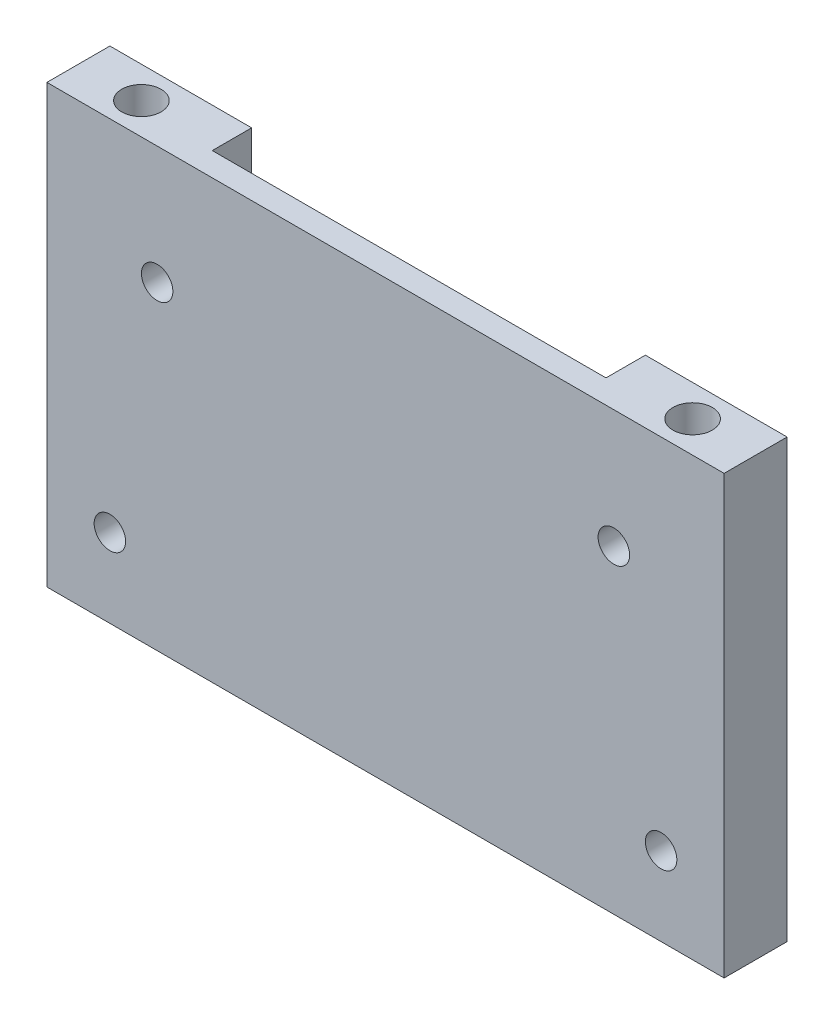
ISO-10303-21;
HEADER;
FILE_DESCRIPTION(('STEP AP214'),'2;1');
FILE_NAME('part.step','',(''),(''),'','','');
FILE_SCHEMA(('AUTOMOTIVE_DESIGN { 1 0 10303 214 1 1 1 1 }'));
ENDSEC;
DATA;
#1=APPLICATION_CONTEXT('core data for automotive mechanical design processes');
#2=APPLICATION_PROTOCOL_DEFINITION('international standard','automotive_design',2000,#1);
#3=PRODUCT_CONTEXT('',#1,'mechanical');
#4=PRODUCT('Part','Part','',(#3));
#5=PRODUCT_RELATED_PRODUCT_CATEGORY('part','',(#4));
#6=PRODUCT_DEFINITION_FORMATION('','',#4);
#7=PRODUCT_DEFINITION_CONTEXT('part definition',#1,'design');
#8=PRODUCT_DEFINITION('design','',#6,#7);
#9=PRODUCT_DEFINITION_SHAPE('','',#8);
#10=(LENGTH_UNIT() NAMED_UNIT(*) SI_UNIT(.MILLI.,.METRE.));
#11=(NAMED_UNIT(*) PLANE_ANGLE_UNIT() SI_UNIT($,.RADIAN.));
#12=(NAMED_UNIT(*) SI_UNIT($,.STERADIAN.) SOLID_ANGLE_UNIT());
#13=UNCERTAINTY_MEASURE_WITH_UNIT(LENGTH_MEASURE(1.E-05),#10,'distance_accuracy_value','');
#14=(GEOMETRIC_REPRESENTATION_CONTEXT(3) GLOBAL_UNCERTAINTY_ASSIGNED_CONTEXT((#13)) GLOBAL_UNIT_ASSIGNED_CONTEXT((#10,
#11,#12)) REPRESENTATION_CONTEXT('',''));
#15=CARTESIAN_POINT('',(0.,0.,0.));
#16=DIRECTION('',(0.,0.,1.));
#17=DIRECTION('',(1.,0.,0.));
#18=AXIS2_PLACEMENT_3D('',#15,#16,#17);
#19=CARTESIAN_POINT('',(0.,55.5,0.));
#20=DIRECTION('',(0.,0.,-1.));
#21=DIRECTION('',(-1.,0.,0.));
#22=AXIS2_PLACEMENT_3D('',#19,#20,#21);
#23=PLANE('',#22);
#24=CARTESIAN_POINT('',(78.,10.,0.));
#25=DIRECTION('',(0.,0.,-1.));
#26=DIRECTION('',(-1.,0.,0.));
#27=AXIS2_PLACEMENT_3D('',#24,#25,#26);
#28=CIRCLE('',#27,2.);
#29=CARTESIAN_POINT('',(76.,10.,0.));
#30=VERTEX_POINT('',#29);
#31=EDGE_CURVE('E221',#30,#30,#28,.T.);
#32=ORIENTED_EDGE('',*,*,#31,.F.);
#33=EDGE_LOOP('',(#32));
#34=FACE_BOUND('',#33,.T.);
#35=CARTESIAN_POINT('',(72.,40.5,0.));
#36=DIRECTION('',(0.,0.,-1.));
#37=DIRECTION('',(-1.,0.,0.));
#38=AXIS2_PLACEMENT_3D('',#35,#36,#37);
#39=CIRCLE('',#38,2.);
#40=CARTESIAN_POINT('',(70.,40.5,0.));
#41=VERTEX_POINT('',#40);
#42=EDGE_CURVE('E232',#41,#41,#39,.T.);
#43=ORIENTED_EDGE('',*,*,#42,.F.);
#44=EDGE_LOOP('',(#43));
#45=FACE_BOUND('',#44,.T.);
#46=DIRECTION('',(0.,-1.,0.));
#47=VECTOR('',#46,1.);
#48=CARTESIAN_POINT('',(68.,55.5,0.));
#49=LINE('',#48,#47);
#50=CARTESIAN_POINT('',(68.,55.5,0.));
#51=VERTEX_POINT('',#50);
#52=CARTESIAN_POINT('',(68.,0.,0.));
#53=VERTEX_POINT('',#52);
#54=EDGE_CURVE('E97',#51,#53,#49,.T.);
#55=ORIENTED_EDGE('',*,*,#54,.F.);
#56=DIRECTION('',(-1.,0.,0.));
#57=VECTOR('',#56,1.);
#58=CARTESIAN_POINT('',(0.,55.5,0.));
#59=LINE('',#58,#57);
#60=CARTESIAN_POINT('',(86.,55.5,0.));
#61=VERTEX_POINT('',#60);
#62=EDGE_CURVE('E134',#61,#51,#59,.T.);
#63=ORIENTED_EDGE('',*,*,#62,.F.);
#64=DIRECTION('',(0.,1.,0.));
#65=VECTOR('',#64,1.);
#66=CARTESIAN_POINT('',(86.,0.,0.));
#67=LINE('',#66,#65);
#68=CARTESIAN_POINT('',(86.,0.,0.));
#69=VERTEX_POINT('',#68);
#70=EDGE_CURVE('E122',#69,#61,#67,.T.);
#71=ORIENTED_EDGE('',*,*,#70,.F.);
#72=DIRECTION('',(1.,0.,0.));
#73=VECTOR('',#72,1.);
#74=CARTESIAN_POINT('',(0.,0.,0.));
#75=LINE('',#74,#73);
#76=EDGE_CURVE('E115',#53,#69,#75,.T.);
#77=ORIENTED_EDGE('',*,*,#76,.F.);
#78=EDGE_LOOP('',(#55,#63,#71,#77));
#79=FACE_BOUND('',#78,.T.);
#80=ADVANCED_FACE('F32',(#34,#45,#79),#23,.T.);
#81=CARTESIAN_POINT('',(0.,0.,8.));
#82=DIRECTION('',(1.,0.,0.));
#83=DIRECTION('',(0.,0.,-1.));
#84=AXIS2_PLACEMENT_3D('',#81,#82,#83);
#85=PLANE('',#84);
#86=DIRECTION('',(0.,-1.,0.));
#87=VECTOR('',#86,1.);
#88=CARTESIAN_POINT('',(0.,0.,0.));
#89=LINE('',#88,#87);
#90=CARTESIAN_POINT('',(0.,55.5,0.));
#91=VERTEX_POINT('',#90);
#92=CARTESIAN_POINT('',(0.,0.,0.));
#93=VERTEX_POINT('',#92);
#94=EDGE_CURVE('E124',#91,#93,#89,.T.);
#95=ORIENTED_EDGE('',*,*,#94,.T.);
#96=DIRECTION('',(0.,0.,-1.));
#97=VECTOR('',#96,1.);
#98=CARTESIAN_POINT('',(0.,0.,8.));
#99=LINE('',#98,#97);
#100=CARTESIAN_POINT('',(0.,0.,8.));
#101=VERTEX_POINT('',#100);
#102=EDGE_CURVE('E11',#101,#93,#99,.T.);
#103=ORIENTED_EDGE('',*,*,#102,.F.);
#104=DIRECTION('',(0.,-1.,0.));
#105=VECTOR('',#104,1.);
#106=CARTESIAN_POINT('',(0.,0.,8.));
#107=LINE('',#106,#105);
#108=CARTESIAN_POINT('',(0.,55.5,8.));
#109=VERTEX_POINT('',#108);
#110=EDGE_CURVE('E136',#109,#101,#107,.T.);
#111=ORIENTED_EDGE('',*,*,#110,.F.);
#112=DIRECTION('',(0.,0.,-1.));
#113=VECTOR('',#112,1.);
#114=CARTESIAN_POINT('',(0.,55.5,8.));
#115=LINE('',#114,#113);
#116=EDGE_CURVE('E143',#109,#91,#115,.T.);
#117=ORIENTED_EDGE('',*,*,#116,.T.);
#118=EDGE_LOOP('',(#95,#103,#111,#117));
#119=FACE_BOUND('',#118,.T.);
#120=ADVANCED_FACE('F34',(#119),#85,.F.);
#121=CARTESIAN_POINT('',(0.,0.,8.));
#122=DIRECTION('',(0.,1.,0.));
#123=DIRECTION('',(0.,0.,1.));
#124=AXIS2_PLACEMENT_3D('',#121,#122,#123);
#125=PLANE('',#124);
#126=DIRECTION('',(-1.,0.,0.));
#127=VECTOR('',#126,1.);
#128=CARTESIAN_POINT('',(68.,0.,5.));
#129=LINE('',#128,#127);
#130=CARTESIAN_POINT('',(68.,0.,5.));
#131=VERTEX_POINT('',#130);
#132=CARTESIAN_POINT('',(18.,0.,5.));
#133=VERTEX_POINT('',#132);
#134=EDGE_CURVE('E118',#131,#133,#129,.T.);
#135=ORIENTED_EDGE('',*,*,#134,.F.);
#136=DIRECTION('',(0.,0.,-1.));
#137=VECTOR('',#136,1.);
#138=CARTESIAN_POINT('',(68.,0.,5.));
#139=LINE('',#138,#137);
#140=EDGE_CURVE('E100',#131,#53,#139,.T.);
#141=ORIENTED_EDGE('',*,*,#140,.T.);
#142=ORIENTED_EDGE('',*,*,#76,.T.);
#143=DIRECTION('',(0.,0.,-1.));
#144=VECTOR('',#143,1.);
#145=CARTESIAN_POINT('',(86.,0.,8.));
#146=LINE('',#145,#144);
#147=CARTESIAN_POINT('',(86.,0.,8.));
#148=VERTEX_POINT('',#147);
#149=EDGE_CURVE('E40',#148,#69,#146,.T.);
#150=ORIENTED_EDGE('',*,*,#149,.F.);
#151=DIRECTION('',(1.,0.,0.));
#152=VECTOR('',#151,1.);
#153=CARTESIAN_POINT('',(0.,0.,8.));
#154=LINE('',#153,#152);
#155=EDGE_CURVE('E138',#101,#148,#154,.T.);
#156=ORIENTED_EDGE('',*,*,#155,.F.);
#157=ORIENTED_EDGE('',*,*,#102,.T.);
#158=CARTESIAN_POINT('',(18.,0.,0.));
#159=VERTEX_POINT('',#158);
#160=EDGE_CURVE('E123',#93,#159,#75,.T.);
#161=ORIENTED_EDGE('',*,*,#160,.T.);
#162=DIRECTION('',(0.,0.,-1.));
#163=VECTOR('',#162,1.);
#164=CARTESIAN_POINT('',(18.,0.,5.));
#165=LINE('',#164,#163);
#166=EDGE_CURVE('E47',#133,#159,#165,.T.);
#167=ORIENTED_EDGE('',*,*,#166,.F.);
#168=EDGE_LOOP('',(#135,#141,#142,#150,#156,#157,#161,#167));
#169=FACE_BOUND('',#168,.T.);
#170=ADVANCED_FACE('F113',(#169),#125,.F.);
#171=CARTESIAN_POINT('',(86.,0.,8.));
#172=DIRECTION('',(-1.,0.,0.));
#173=DIRECTION('',(0.,0.,1.));
#174=AXIS2_PLACEMENT_3D('',#171,#172,#173);
#175=PLANE('',#174);
#176=ORIENTED_EDGE('',*,*,#70,.T.);
#177=DIRECTION('',(0.,0.,-1.));
#178=VECTOR('',#177,1.);
#179=CARTESIAN_POINT('',(86.,55.5,8.));
#180=LINE('',#179,#178);
#181=CARTESIAN_POINT('',(86.,55.5,8.));
#182=VERTEX_POINT('',#181);
#183=EDGE_CURVE('E146',#182,#61,#180,.T.);
#184=ORIENTED_EDGE('',*,*,#183,.F.);
#185=DIRECTION('',(0.,1.,0.));
#186=VECTOR('',#185,1.);
#187=CARTESIAN_POINT('',(86.,0.,8.));
#188=LINE('',#187,#186);
#189=EDGE_CURVE('E140',#148,#182,#188,.T.);
#190=ORIENTED_EDGE('',*,*,#189,.F.);
#191=ORIENTED_EDGE('',*,*,#149,.T.);
#192=EDGE_LOOP('',(#176,#184,#190,#191));
#193=FACE_BOUND('',#192,.T.);
#194=ADVANCED_FACE('F150',(#193),#175,.F.);
#195=CARTESIAN_POINT('',(0.,55.5,8.));
#196=DIRECTION('',(0.,-1.,0.));
#197=DIRECTION('',(0.,0.,-1.));
#198=AXIS2_PLACEMENT_3D('',#195,#196,#197);
#199=PLANE('',#198);
#200=ORIENTED_EDGE('',*,*,#62,.T.);
#201=DIRECTION('',(0.,0.,-1.));
#202=VECTOR('',#201,1.);
#203=CARTESIAN_POINT('',(68.,55.5,5.));
#204=LINE('',#203,#202);
#205=CARTESIAN_POINT('',(68.,55.5,5.));
#206=VERTEX_POINT('',#205);
#207=EDGE_CURVE('E103',#206,#51,#204,.T.);
#208=ORIENTED_EDGE('',*,*,#207,.F.);
#209=DIRECTION('',(1.,0.,0.));
#210=VECTOR('',#209,1.);
#211=CARTESIAN_POINT('',(68.,55.5,5.));
#212=LINE('',#211,#210);
#213=CARTESIAN_POINT('',(18.,55.5,5.));
#214=VERTEX_POINT('',#213);
#215=EDGE_CURVE('E119',#214,#206,#212,.T.);
#216=ORIENTED_EDGE('',*,*,#215,.F.);
#217=DIRECTION('',(0.,0.,-1.));
#218=VECTOR('',#217,1.);
#219=CARTESIAN_POINT('',(18.,55.5,5.));
#220=LINE('',#219,#218);
#221=CARTESIAN_POINT('',(18.,55.5,0.));
#222=VERTEX_POINT('',#221);
#223=EDGE_CURVE('E160',#214,#222,#220,.T.);
#224=ORIENTED_EDGE('',*,*,#223,.T.);
#225=EDGE_CURVE('E133',#222,#91,#59,.T.);
#226=ORIENTED_EDGE('',*,*,#225,.T.);
#227=ORIENTED_EDGE('',*,*,#116,.F.);
#228=DIRECTION('',(-1.,0.,0.));
#229=VECTOR('',#228,1.);
#230=CARTESIAN_POINT('',(0.,55.5,8.));
#231=LINE('',#230,#229);
#232=EDGE_CURVE('E55',#182,#109,#231,.T.);
#233=ORIENTED_EDGE('',*,*,#232,.F.);
#234=ORIENTED_EDGE('',*,*,#183,.T.);
#235=EDGE_LOOP('',(#200,#208,#216,#224,#226,#227,#233,#234));
#236=FACE_BOUND('',#235,.T.);
#237=CARTESIAN_POINT('',(7.99999999999999,55.5,4.00000000000001));
#238=DIRECTION('',(0.,1.,0.));
#239=DIRECTION('',(0.,0.,1.));
#240=AXIS2_PLACEMENT_3D('',#237,#238,#239);
#241=CIRCLE('',#240,2.5);
#242=CARTESIAN_POINT('',(7.99999999999999,55.5,6.50000000000001));
#243=VERTEX_POINT('',#242);
#244=EDGE_CURVE('E166',#243,#243,#241,.T.);
#245=ORIENTED_EDGE('',*,*,#244,.F.);
#246=EDGE_LOOP('',(#245));
#247=FACE_BOUND('',#246,.T.);
#248=CARTESIAN_POINT('',(78.,55.5,4.));
#249=DIRECTION('',(0.,1.,0.));
#250=DIRECTION('',(0.,0.,1.));
#251=AXIS2_PLACEMENT_3D('',#248,#249,#250);
#252=CIRCLE('',#251,2.49999999999999);
#253=CARTESIAN_POINT('',(78.,55.5,6.49999999999999));
#254=VERTEX_POINT('',#253);
#255=EDGE_CURVE('E172',#254,#254,#252,.T.);
#256=ORIENTED_EDGE('',*,*,#255,.F.);
#257=EDGE_LOOP('',(#256));
#258=FACE_BOUND('',#257,.T.);
#259=ADVANCED_FACE('F185',(#236,#247,#258),#199,.F.);
#260=CARTESIAN_POINT('',(0.,55.5,8.));
#261=DIRECTION('',(0.,0.,-1.));
#262=DIRECTION('',(-1.,0.,0.));
#263=AXIS2_PLACEMENT_3D('',#260,#261,#262);
#264=PLANE('',#263);
#265=CARTESIAN_POINT('',(7.99999999999998,10.,8.));
#266=DIRECTION('',(0.,0.,-1.));
#267=DIRECTION('',(-1.,0.,0.));
#268=AXIS2_PLACEMENT_3D('',#265,#266,#267);
#269=CIRCLE('',#268,2.);
#270=CARTESIAN_POINT('',(5.99999999999998,10.,8.));
#271=VERTEX_POINT('',#270);
#272=EDGE_CURVE('E218',#271,#271,#269,.T.);
#273=ORIENTED_EDGE('',*,*,#272,.T.);
#274=EDGE_LOOP('',(#273));
#275=FACE_BOUND('',#274,.T.);
#276=CARTESIAN_POINT('',(14.,40.5,8.));
#277=DIRECTION('',(0.,0.,-1.));
#278=DIRECTION('',(-1.,0.,0.));
#279=AXIS2_PLACEMENT_3D('',#276,#277,#278);
#280=CIRCLE('',#279,2.);
#281=CARTESIAN_POINT('',(12.,40.5,8.));
#282=VERTEX_POINT('',#281);
#283=EDGE_CURVE('E217',#282,#282,#280,.T.);
#284=ORIENTED_EDGE('',*,*,#283,.T.);
#285=EDGE_LOOP('',(#284));
#286=FACE_BOUND('',#285,.T.);
#287=CARTESIAN_POINT('',(78.,10.,8.));
#288=DIRECTION('',(0.,0.,-1.));
#289=DIRECTION('',(-1.,0.,0.));
#290=AXIS2_PLACEMENT_3D('',#287,#288,#289);
#291=CIRCLE('',#290,2.);
#292=CARTESIAN_POINT('',(76.,10.,8.));
#293=VERTEX_POINT('',#292);
#294=EDGE_CURVE('E229',#293,#293,#291,.T.);
#295=ORIENTED_EDGE('',*,*,#294,.T.);
#296=EDGE_LOOP('',(#295));
#297=FACE_BOUND('',#296,.T.);
#298=CARTESIAN_POINT('',(72.,40.5,8.));
#299=DIRECTION('',(0.,0.,-1.));
#300=DIRECTION('',(-1.,0.,0.));
#301=AXIS2_PLACEMENT_3D('',#298,#299,#300);
#302=CIRCLE('',#301,2.);
#303=CARTESIAN_POINT('',(70.,40.5,8.));
#304=VERTEX_POINT('',#303);
#305=EDGE_CURVE('E109',#304,#304,#302,.T.);
#306=ORIENTED_EDGE('',*,*,#305,.T.);
#307=EDGE_LOOP('',(#306));
#308=FACE_BOUND('',#307,.T.);
#309=ORIENTED_EDGE('',*,*,#110,.T.);
#310=ORIENTED_EDGE('',*,*,#155,.T.);
#311=ORIENTED_EDGE('',*,*,#189,.T.);
#312=ORIENTED_EDGE('',*,*,#232,.T.);
#313=EDGE_LOOP('',(#309,#310,#311,#312));
#314=FACE_BOUND('',#313,.T.);
#315=ADVANCED_FACE('F154',(#275,#286,#297,#308,#314),#264,.F.);
#316=CARTESIAN_POINT('',(7.99999999999998,10.,0.));
#317=DIRECTION('',(0.,0.,-1.));
#318=DIRECTION('',(-1.,0.,0.));
#319=AXIS2_PLACEMENT_3D('',#316,#317,#318);
#320=CIRCLE('',#319,2.);
#321=CARTESIAN_POINT('',(5.99999999999998,10.,0.));
#322=VERTEX_POINT('',#321);
#323=EDGE_CURVE('E212',#322,#322,#320,.T.);
#324=ORIENTED_EDGE('',*,*,#323,.F.);
#325=EDGE_LOOP('',(#324));
#326=FACE_BOUND('',#325,.T.);
#327=CARTESIAN_POINT('',(14.,40.5,0.));
#328=DIRECTION('',(0.,0.,-1.));
#329=DIRECTION('',(-1.,0.,0.));
#330=AXIS2_PLACEMENT_3D('',#327,#328,#329);
#331=CIRCLE('',#330,2.);
#332=CARTESIAN_POINT('',(12.,40.5,0.));
#333=VERTEX_POINT('',#332);
#334=EDGE_CURVE('E215',#333,#333,#331,.T.);
#335=ORIENTED_EDGE('',*,*,#334,.F.);
#336=EDGE_LOOP('',(#335));
#337=FACE_BOUND('',#336,.T.);
#338=DIRECTION('',(0.,1.,0.));
#339=VECTOR('',#338,1.);
#340=CARTESIAN_POINT('',(18.,55.5,0.));
#341=LINE('',#340,#339);
#342=EDGE_CURVE('E108',#159,#222,#341,.T.);
#343=ORIENTED_EDGE('',*,*,#342,.F.);
#344=ORIENTED_EDGE('',*,*,#160,.F.);
#345=ORIENTED_EDGE('',*,*,#94,.F.);
#346=ORIENTED_EDGE('',*,*,#225,.F.);
#347=EDGE_LOOP('',(#343,#344,#345,#346));
#348=FACE_BOUND('',#347,.T.);
#349=ADVANCED_FACE('F159',(#326,#337,#348),#23,.T.);
#350=CARTESIAN_POINT('',(78.,30.5,4.));
#351=DIRECTION('',(0.,1.,0.));
#352=DIRECTION('',(0.,0.,1.));
#353=AXIS2_PLACEMENT_3D('',#350,#351,#352);
#354=CYLINDRICAL_SURFACE('',#353,2.49999999999999);
#355=CARTESIAN_POINT('',(78.,30.5,4.));
#356=DIRECTION('',(0.,1.,0.));
#357=DIRECTION('',(0.,0.,1.));
#358=AXIS2_PLACEMENT_3D('',#355,#356,#357);
#359=CIRCLE('',#358,2.49999999999999);
#360=CARTESIAN_POINT('',(78.,30.5,6.49999999999999));
#361=VERTEX_POINT('',#360);
#362=EDGE_CURVE('E128',#361,#361,#359,.T.);
#363=ORIENTED_EDGE('',*,*,#362,.F.);
#364=EDGE_LOOP('',(#363));
#365=FACE_BOUND('',#364,.T.);
#366=ORIENTED_EDGE('',*,*,#255,.T.);
#367=EDGE_LOOP('',(#366));
#368=FACE_BOUND('',#367,.T.);
#369=ADVANCED_FACE('F179',(#365,#368),#354,.F.);
#370=CARTESIAN_POINT('',(78.,30.5,4.));
#371=DIRECTION('',(0.,1.,0.));
#372=DIRECTION('',(0.,0.,1.));
#373=AXIS2_PLACEMENT_3D('',#370,#371,#372);
#374=PLANE('',#373);
#375=ORIENTED_EDGE('',*,*,#362,.T.);
#376=EDGE_LOOP('',(#375));
#377=FACE_BOUND('',#376,.T.);
#378=ADVANCED_FACE('F177',(#377),#374,.T.);
#379=CARTESIAN_POINT('',(7.99999999999999,30.5,4.00000000000001));
#380=DIRECTION('',(0.,1.,0.));
#381=DIRECTION('',(0.,0.,1.));
#382=AXIS2_PLACEMENT_3D('',#379,#380,#381);
#383=CYLINDRICAL_SURFACE('',#382,2.5);
#384=CARTESIAN_POINT('',(7.99999999999999,30.5,4.00000000000001));
#385=DIRECTION('',(0.,1.,0.));
#386=DIRECTION('',(0.,0.,1.));
#387=AXIS2_PLACEMENT_3D('',#384,#385,#386);
#388=CIRCLE('',#387,2.5);
#389=CARTESIAN_POINT('',(7.99999999999999,30.5,6.50000000000001));
#390=VERTEX_POINT('',#389);
#391=EDGE_CURVE('E169',#390,#390,#388,.T.);
#392=ORIENTED_EDGE('',*,*,#391,.F.);
#393=EDGE_LOOP('',(#392));
#394=FACE_BOUND('',#393,.T.);
#395=ORIENTED_EDGE('',*,*,#244,.T.);
#396=EDGE_LOOP('',(#395));
#397=FACE_BOUND('',#396,.T.);
#398=ADVANCED_FACE('F263',(#394,#397),#383,.F.);
#399=CARTESIAN_POINT('',(7.99999999999999,30.5,4.00000000000001));
#400=DIRECTION('',(0.,1.,0.));
#401=DIRECTION('',(0.,0.,1.));
#402=AXIS2_PLACEMENT_3D('',#399,#400,#401);
#403=PLANE('',#402);
#404=ORIENTED_EDGE('',*,*,#391,.T.);
#405=EDGE_LOOP('',(#404));
#406=FACE_BOUND('',#405,.T.);
#407=ADVANCED_FACE('F257',(#406),#403,.T.);
#408=CARTESIAN_POINT('',(68.,55.5,5.));
#409=DIRECTION('',(1.,0.,0.));
#410=DIRECTION('',(0.,0.,-1.));
#411=AXIS2_PLACEMENT_3D('',#408,#409,#410);
#412=PLANE('',#411);
#413=ORIENTED_EDGE('',*,*,#54,.T.);
#414=ORIENTED_EDGE('',*,*,#140,.F.);
#415=DIRECTION('',(0.,-1.,0.));
#416=VECTOR('',#415,1.);
#417=CARTESIAN_POINT('',(68.,55.5,5.));
#418=LINE('',#417,#416);
#419=EDGE_CURVE('E238',#206,#131,#418,.T.);
#420=ORIENTED_EDGE('',*,*,#419,.F.);
#421=ORIENTED_EDGE('',*,*,#207,.T.);
#422=EDGE_LOOP('',(#413,#414,#420,#421));
#423=FACE_BOUND('',#422,.T.);
#424=ADVANCED_FACE('F99',(#423),#412,.F.);
#425=CARTESIAN_POINT('',(18.,55.5,5.));
#426=DIRECTION('',(-1.,0.,0.));
#427=DIRECTION('',(0.,-1.,0.));
#428=AXIS2_PLACEMENT_3D('',#425,#426,#427);
#429=PLANE('',#428);
#430=ORIENTED_EDGE('',*,*,#342,.T.);
#431=ORIENTED_EDGE('',*,*,#223,.F.);
#432=DIRECTION('',(0.,1.,0.));
#433=VECTOR('',#432,1.);
#434=CARTESIAN_POINT('',(18.,55.5,5.));
#435=LINE('',#434,#433);
#436=EDGE_CURVE('E241',#133,#214,#435,.T.);
#437=ORIENTED_EDGE('',*,*,#436,.F.);
#438=ORIENTED_EDGE('',*,*,#166,.T.);
#439=EDGE_LOOP('',(#430,#431,#437,#438));
#440=FACE_BOUND('',#439,.T.);
#441=ADVANCED_FACE('F248',(#440),#429,.F.);
#442=CARTESIAN_POINT('',(68.,0.,5.));
#443=DIRECTION('',(0.,0.,-1.));
#444=DIRECTION('',(-1.,0.,0.));
#445=AXIS2_PLACEMENT_3D('',#442,#443,#444);
#446=PLANE('',#445);
#447=ORIENTED_EDGE('',*,*,#419,.T.);
#448=ORIENTED_EDGE('',*,*,#134,.T.);
#449=ORIENTED_EDGE('',*,*,#436,.T.);
#450=ORIENTED_EDGE('',*,*,#215,.T.);
#451=EDGE_LOOP('',(#447,#448,#449,#450));
#452=FACE_BOUND('',#451,.T.);
#453=ADVANCED_FACE('F247',(#452),#446,.T.);
#454=CARTESIAN_POINT('',(72.,40.5,8.));
#455=DIRECTION('',(0.,0.,-1.));
#456=DIRECTION('',(-1.,0.,0.));
#457=AXIS2_PLACEMENT_3D('',#454,#455,#456);
#458=CYLINDRICAL_SURFACE('',#457,2.);
#459=ORIENTED_EDGE('',*,*,#305,.F.);
#460=EDGE_LOOP('',(#459));
#461=FACE_BOUND('',#460,.T.);
#462=ORIENTED_EDGE('',*,*,#42,.T.);
#463=EDGE_LOOP('',(#462));
#464=FACE_BOUND('',#463,.T.);
#465=ADVANCED_FACE('F255',(#461,#464),#458,.F.);
#466=CARTESIAN_POINT('',(78.,10.,8.));
#467=DIRECTION('',(0.,0.,-1.));
#468=DIRECTION('',(-1.,0.,0.));
#469=AXIS2_PLACEMENT_3D('',#466,#467,#468);
#470=CYLINDRICAL_SURFACE('',#469,2.);
#471=ORIENTED_EDGE('',*,*,#294,.F.);
#472=EDGE_LOOP('',(#471));
#473=FACE_BOUND('',#472,.T.);
#474=ORIENTED_EDGE('',*,*,#31,.T.);
#475=EDGE_LOOP('',(#474));
#476=FACE_BOUND('',#475,.T.);
#477=ADVANCED_FACE('F322',(#473,#476),#470,.F.);
#478=CARTESIAN_POINT('',(14.,40.5,8.));
#479=DIRECTION('',(0.,0.,-1.));
#480=DIRECTION('',(-1.,0.,0.));
#481=AXIS2_PLACEMENT_3D('',#478,#479,#480);
#482=CYLINDRICAL_SURFACE('',#481,2.);
#483=ORIENTED_EDGE('',*,*,#283,.F.);
#484=EDGE_LOOP('',(#483));
#485=FACE_BOUND('',#484,.T.);
#486=ORIENTED_EDGE('',*,*,#334,.T.);
#487=EDGE_LOOP('',(#486));
#488=FACE_BOUND('',#487,.T.);
#489=ADVANCED_FACE('F331',(#485,#488),#482,.F.);
#490=CARTESIAN_POINT('',(7.99999999999998,10.,8.));
#491=DIRECTION('',(0.,0.,-1.));
#492=DIRECTION('',(-1.,0.,0.));
#493=AXIS2_PLACEMENT_3D('',#490,#491,#492);
#494=CYLINDRICAL_SURFACE('',#493,2.);
#495=ORIENTED_EDGE('',*,*,#272,.F.);
#496=EDGE_LOOP('',(#495));
#497=FACE_BOUND('',#496,.T.);
#498=ORIENTED_EDGE('',*,*,#323,.T.);
#499=EDGE_LOOP('',(#498));
#500=FACE_BOUND('',#499,.T.);
#501=ADVANCED_FACE('F341',(#497,#500),#494,.F.);
#502=CLOSED_SHELL('',(#80,#120,#170,#194,#259,#315,#349,#369,#378,#398,#407,#424,#441,#453,#465,
#477,#489,#501));
#503=MANIFOLD_SOLID_BREP('B2',#502);
#504=ADVANCED_BREP_SHAPE_REPRESENTATION('',(#18,#503),#14);
#505=SHAPE_DEFINITION_REPRESENTATION(#9,#504);
ENDSEC;
END-ISO-10303-21;
